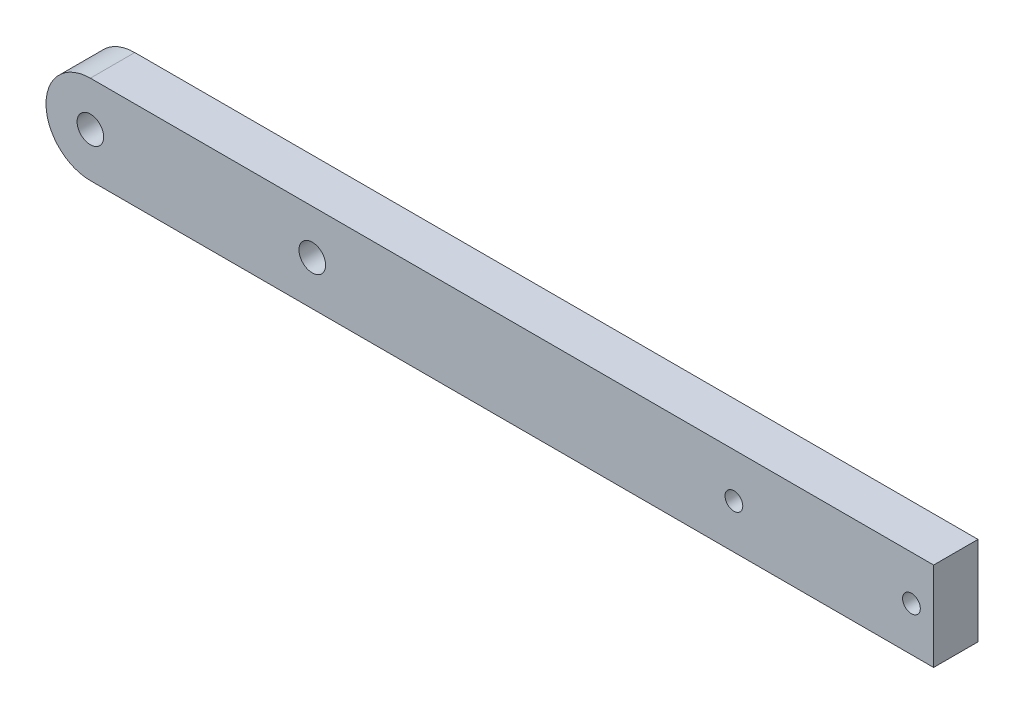
ISO-10303-21;
HEADER;
FILE_DESCRIPTION(('STEP AP214'),'2;1');
FILE_NAME('part.step','',(''),(''),'','','');
FILE_SCHEMA(('AUTOMOTIVE_DESIGN { 1 0 10303 214 1 1 1 1 }'));
ENDSEC;
DATA;
#1=APPLICATION_CONTEXT('core data for automotive mechanical design processes');
#2=APPLICATION_PROTOCOL_DEFINITION('international standard','automotive_design',2000,#1);
#3=PRODUCT_CONTEXT('',#1,'mechanical');
#4=PRODUCT('Part','Part','',(#3));
#5=PRODUCT_RELATED_PRODUCT_CATEGORY('part','',(#4));
#6=PRODUCT_DEFINITION_FORMATION('','',#4);
#7=PRODUCT_DEFINITION_CONTEXT('part definition',#1,'design');
#8=PRODUCT_DEFINITION('design','',#6,#7);
#9=PRODUCT_DEFINITION_SHAPE('','',#8);
#10=(LENGTH_UNIT() NAMED_UNIT(*) SI_UNIT(.MILLI.,.METRE.));
#11=(NAMED_UNIT(*) PLANE_ANGLE_UNIT() SI_UNIT($,.RADIAN.));
#12=(NAMED_UNIT(*) SI_UNIT($,.STERADIAN.) SOLID_ANGLE_UNIT());
#13=UNCERTAINTY_MEASURE_WITH_UNIT(LENGTH_MEASURE(1.E-05),#10,'distance_accuracy_value','');
#14=(GEOMETRIC_REPRESENTATION_CONTEXT(3) GLOBAL_UNCERTAINTY_ASSIGNED_CONTEXT((#13)) GLOBAL_UNIT_ASSIGNED_CONTEXT((#10,
#11,#12)) REPRESENTATION_CONTEXT('',''));
#15=CARTESIAN_POINT('',(0.,0.,0.));
#16=DIRECTION('',(0.,0.,1.));
#17=DIRECTION('',(1.,0.,0.));
#18=AXIS2_PLACEMENT_3D('',#15,#16,#17);
#19=CARTESIAN_POINT('',(0.,0.,-10.));
#20=DIRECTION('',(0.,0.,-1.));
#21=DIRECTION('',(1.,0.,0.));
#22=AXIS2_PLACEMENT_3D('',#19,#20,#21);
#23=PLANE('',#22);
#24=CARTESIAN_POINT('',(95.,0.,-10.));
#25=DIRECTION('',(0.,0.,1.));
#26=DIRECTION('',(1.,0.,0.));
#27=AXIS2_PLACEMENT_3D('',#24,#25,#26);
#28=CIRCLE('',#27,2.);
#29=CARTESIAN_POINT('',(97.,0.,-10.));
#30=VERTEX_POINT('',#29);
#31=EDGE_CURVE('E148',#30,#30,#28,.T.);
#32=ORIENTED_EDGE('',*,*,#31,.T.);
#33=EDGE_LOOP('',(#32));
#34=FACE_BOUND('',#33,.T.);
#35=CARTESIAN_POINT('',(-90.,0.,-10.));
#36=DIRECTION('',(0.,0.,1.));
#37=DIRECTION('',(1.,0.,0.));
#38=AXIS2_PLACEMENT_3D('',#35,#36,#37);
#39=CIRCLE('',#38,2.99999999999999);
#40=CARTESIAN_POINT('',(-87.,0.,-10.));
#41=VERTEX_POINT('',#40);
#42=EDGE_CURVE('E118',#41,#41,#39,.T.);
#43=ORIENTED_EDGE('',*,*,#42,.T.);
#44=EDGE_LOOP('',(#43));
#45=FACE_BOUND('',#44,.T.);
#46=CARTESIAN_POINT('',(-90.,0.,-10.));
#47=DIRECTION('',(0.,0.,1.));
#48=DIRECTION('',(1.,0.,0.));
#49=AXIS2_PLACEMENT_3D('',#46,#47,#48);
#50=CIRCLE('',#49,10.);
#51=CARTESIAN_POINT('',(-90.,10.,-10.));
#52=VERTEX_POINT('',#51);
#53=CARTESIAN_POINT('',(-100.,0.,-10.));
#54=VERTEX_POINT('',#53);
#55=EDGE_CURVE('E110',#52,#54,#50,.T.);
#56=ORIENTED_EDGE('',*,*,#55,.F.);
#57=DIRECTION('',(-1.,0.,0.));
#58=VECTOR('',#57,1.);
#59=CARTESIAN_POINT('',(-100.,10.,-10.));
#60=LINE('',#59,#58);
#61=CARTESIAN_POINT('',(100.,10.,-10.));
#62=VERTEX_POINT('',#61);
#63=EDGE_CURVE('E91',#62,#52,#60,.T.);
#64=ORIENTED_EDGE('',*,*,#63,.F.);
#65=DIRECTION('',(0.,1.,0.));
#66=VECTOR('',#65,1.);
#67=CARTESIAN_POINT('',(100.,10.,-10.));
#68=LINE('',#67,#66);
#69=CARTESIAN_POINT('',(100.,-10.,-10.));
#70=VERTEX_POINT('',#69);
#71=EDGE_CURVE('E102',#70,#62,#68,.T.);
#72=ORIENTED_EDGE('',*,*,#71,.F.);
#73=DIRECTION('',(1.,0.,0.));
#74=VECTOR('',#73,1.);
#75=CARTESIAN_POINT('',(-100.,-10.,-10.));
#76=LINE('',#75,#74);
#77=CARTESIAN_POINT('',(-90.,-10.,-10.));
#78=VERTEX_POINT('',#77);
#79=EDGE_CURVE('E111',#78,#70,#76,.T.);
#80=ORIENTED_EDGE('',*,*,#79,.F.);
#81=CARTESIAN_POINT('',(-90.,0.,-10.));
#82=DIRECTION('',(0.,0.,1.));
#83=DIRECTION('',(1.,0.,0.));
#84=AXIS2_PLACEMENT_3D('',#81,#82,#83);
#85=CIRCLE('',#84,10.);
#86=EDGE_CURVE('E50',#54,#78,#85,.T.);
#87=ORIENTED_EDGE('',*,*,#86,.F.);
#88=EDGE_LOOP('',(#56,#64,#72,#80,#87));
#89=FACE_BOUND('',#88,.T.);
#90=CARTESIAN_POINT('',(-40.,0.,-10.));
#91=DIRECTION('',(0.,0.,1.));
#92=DIRECTION('',(1.,0.,0.));
#93=AXIS2_PLACEMENT_3D('',#90,#91,#92);
#94=CIRCLE('',#93,3.00000000000001);
#95=CARTESIAN_POINT('',(-37.,0.,-10.));
#96=VERTEX_POINT('',#95);
#97=EDGE_CURVE('E154',#96,#96,#94,.T.);
#98=ORIENTED_EDGE('',*,*,#97,.T.);
#99=EDGE_LOOP('',(#98));
#100=FACE_BOUND('',#99,.T.);
#101=CARTESIAN_POINT('',(55.,0.,-10.));
#102=DIRECTION('',(0.,0.,1.));
#103=DIRECTION('',(1.,0.,0.));
#104=AXIS2_PLACEMENT_3D('',#101,#102,#103);
#105=CIRCLE('',#104,2.);
#106=CARTESIAN_POINT('',(57.,0.,-10.));
#107=VERTEX_POINT('',#106);
#108=EDGE_CURVE('E140',#107,#107,#105,.T.);
#109=ORIENTED_EDGE('',*,*,#108,.T.);
#110=EDGE_LOOP('',(#109));
#111=FACE_BOUND('',#110,.T.);
#112=ADVANCED_FACE('F41',(#34,#45,#89,#100,#111),#23,.T.);
#113=CARTESIAN_POINT('',(0.,0.,0.));
#114=DIRECTION('',(0.,0.,-1.));
#115=DIRECTION('',(1.,0.,0.));
#116=AXIS2_PLACEMENT_3D('',#113,#114,#115);
#117=PLANE('',#116);
#118=DIRECTION('',(1.,0.,0.));
#119=VECTOR('',#118,1.);
#120=CARTESIAN_POINT('',(-100.,-10.,0.));
#121=LINE('',#120,#119);
#122=CARTESIAN_POINT('',(-90.,-10.,0.));
#123=VERTEX_POINT('',#122);
#124=CARTESIAN_POINT('',(100.,-10.,0.));
#125=VERTEX_POINT('',#124);
#126=EDGE_CURVE('E107',#123,#125,#121,.T.);
#127=ORIENTED_EDGE('',*,*,#126,.T.);
#128=DIRECTION('',(0.,1.,0.));
#129=VECTOR('',#128,1.);
#130=CARTESIAN_POINT('',(100.,10.,0.));
#131=LINE('',#130,#129);
#132=CARTESIAN_POINT('',(100.,10.,0.));
#133=VERTEX_POINT('',#132);
#134=EDGE_CURVE('E116',#125,#133,#131,.T.);
#135=ORIENTED_EDGE('',*,*,#134,.T.);
#136=DIRECTION('',(-1.,0.,0.));
#137=VECTOR('',#136,1.);
#138=CARTESIAN_POINT('',(-100.,10.,0.));
#139=LINE('',#138,#137);
#140=CARTESIAN_POINT('',(-90.,10.,0.));
#141=VERTEX_POINT('',#140);
#142=EDGE_CURVE('E94',#133,#141,#139,.T.);
#143=ORIENTED_EDGE('',*,*,#142,.T.);
#144=CARTESIAN_POINT('',(-90.,0.,0.));
#145=DIRECTION('',(0.,0.,1.));
#146=DIRECTION('',(1.,0.,0.));
#147=AXIS2_PLACEMENT_3D('',#144,#145,#146);
#148=CIRCLE('',#147,10.);
#149=CARTESIAN_POINT('',(-100.,0.,0.));
#150=VERTEX_POINT('',#149);
#151=EDGE_CURVE('E124',#150,#141,#148,.F.);
#152=ORIENTED_EDGE('',*,*,#151,.F.);
#153=CARTESIAN_POINT('',(-90.,0.,0.));
#154=DIRECTION('',(0.,0.,1.));
#155=DIRECTION('',(1.,0.,0.));
#156=AXIS2_PLACEMENT_3D('',#153,#154,#155);
#157=CIRCLE('',#156,10.);
#158=EDGE_CURVE('E126',#123,#150,#157,.F.);
#159=ORIENTED_EDGE('',*,*,#158,.F.);
#160=EDGE_LOOP('',(#127,#135,#143,#152,#159));
#161=FACE_BOUND('',#160,.T.);
#162=CARTESIAN_POINT('',(-90.,0.,0.));
#163=DIRECTION('',(0.,0.,1.));
#164=DIRECTION('',(1.,0.,0.));
#165=AXIS2_PLACEMENT_3D('',#162,#163,#164);
#166=CIRCLE('',#165,2.99999999999999);
#167=CARTESIAN_POINT('',(-87.,0.,0.));
#168=VERTEX_POINT('',#167);
#169=EDGE_CURVE('E157',#168,#168,#166,.T.);
#170=ORIENTED_EDGE('',*,*,#169,.F.);
#171=EDGE_LOOP('',(#170));
#172=FACE_BOUND('',#171,.T.);
#173=CARTESIAN_POINT('',(-40.,0.,0.));
#174=DIRECTION('',(0.,0.,1.));
#175=DIRECTION('',(1.,0.,0.));
#176=AXIS2_PLACEMENT_3D('',#173,#174,#175);
#177=CIRCLE('',#176,3.00000000000001);
#178=CARTESIAN_POINT('',(-37.,0.,0.));
#179=VERTEX_POINT('',#178);
#180=EDGE_CURVE('E151',#179,#179,#177,.T.);
#181=ORIENTED_EDGE('',*,*,#180,.F.);
#182=EDGE_LOOP('',(#181));
#183=FACE_BOUND('',#182,.T.);
#184=CARTESIAN_POINT('',(95.,0.,0.));
#185=DIRECTION('',(0.,0.,1.));
#186=DIRECTION('',(1.,0.,0.));
#187=AXIS2_PLACEMENT_3D('',#184,#185,#186);
#188=CIRCLE('',#187,2.);
#189=CARTESIAN_POINT('',(97.,0.,0.));
#190=VERTEX_POINT('',#189);
#191=EDGE_CURVE('E145',#190,#190,#188,.T.);
#192=ORIENTED_EDGE('',*,*,#191,.F.);
#193=EDGE_LOOP('',(#192));
#194=FACE_BOUND('',#193,.T.);
#195=CARTESIAN_POINT('',(55.,0.,0.));
#196=DIRECTION('',(0.,0.,1.));
#197=DIRECTION('',(1.,0.,0.));
#198=AXIS2_PLACEMENT_3D('',#195,#196,#197);
#199=CIRCLE('',#198,2.);
#200=CARTESIAN_POINT('',(57.,0.,0.));
#201=VERTEX_POINT('',#200);
#202=EDGE_CURVE('E138',#201,#201,#199,.T.);
#203=ORIENTED_EDGE('',*,*,#202,.F.);
#204=EDGE_LOOP('',(#203));
#205=FACE_BOUND('',#204,.T.);
#206=ADVANCED_FACE('F135',(#161,#172,#183,#194,#205),#117,.F.);
#207=CARTESIAN_POINT('',(100.,10.,-10.));
#208=DIRECTION('',(-1.,0.,0.));
#209=DIRECTION('',(0.,0.,-1.));
#210=AXIS2_PLACEMENT_3D('',#207,#208,#209);
#211=PLANE('',#210);
#212=ORIENTED_EDGE('',*,*,#134,.F.);
#213=DIRECTION('',(0.,0.,1.));
#214=VECTOR('',#213,1.);
#215=CARTESIAN_POINT('',(100.,-10.,-10.));
#216=LINE('',#215,#214);
#217=EDGE_CURVE('E99',#70,#125,#216,.T.);
#218=ORIENTED_EDGE('',*,*,#217,.F.);
#219=ORIENTED_EDGE('',*,*,#71,.T.);
#220=DIRECTION('',(0.,0.,1.));
#221=VECTOR('',#220,1.);
#222=CARTESIAN_POINT('',(100.,10.,-10.));
#223=LINE('',#222,#221);
#224=EDGE_CURVE('E87',#62,#133,#223,.T.);
#225=ORIENTED_EDGE('',*,*,#224,.T.);
#226=EDGE_LOOP('',(#212,#218,#219,#225));
#227=FACE_BOUND('',#226,.T.);
#228=ADVANCED_FACE('F103',(#227),#211,.F.);
#229=CARTESIAN_POINT('',(-100.,10.,-10.));
#230=DIRECTION('',(0.,-1.,0.));
#231=DIRECTION('',(0.,0.,1.));
#232=AXIS2_PLACEMENT_3D('',#229,#230,#231);
#233=PLANE('',#232);
#234=ORIENTED_EDGE('',*,*,#142,.F.);
#235=ORIENTED_EDGE('',*,*,#224,.F.);
#236=ORIENTED_EDGE('',*,*,#63,.T.);
#237=DIRECTION('',(0.,0.,1.));
#238=VECTOR('',#237,1.);
#239=CARTESIAN_POINT('',(-90.,10.,-10.));
#240=LINE('',#239,#238);
#241=EDGE_CURVE('E11',#141,#52,#240,.F.);
#242=ORIENTED_EDGE('',*,*,#241,.F.);
#243=EDGE_LOOP('',(#234,#235,#236,#242));
#244=FACE_BOUND('',#243,.T.);
#245=ADVANCED_FACE('F89',(#244),#233,.F.);
#246=CARTESIAN_POINT('',(-100.,-10.,-10.));
#247=DIRECTION('',(0.,1.,0.));
#248=DIRECTION('',(0.,0.,-1.));
#249=AXIS2_PLACEMENT_3D('',#246,#247,#248);
#250=PLANE('',#249);
#251=ORIENTED_EDGE('',*,*,#79,.T.);
#252=ORIENTED_EDGE('',*,*,#217,.T.);
#253=ORIENTED_EDGE('',*,*,#126,.F.);
#254=DIRECTION('',(0.,0.,1.));
#255=VECTOR('',#254,1.);
#256=CARTESIAN_POINT('',(-90.,-10.,-10.));
#257=LINE('',#256,#255);
#258=EDGE_CURVE('E98',#78,#123,#257,.T.);
#259=ORIENTED_EDGE('',*,*,#258,.F.);
#260=EDGE_LOOP('',(#251,#252,#253,#259));
#261=FACE_BOUND('',#260,.T.);
#262=ADVANCED_FACE('F132',(#261),#250,.F.);
#263=CARTESIAN_POINT('',(-90.,0.,-10.));
#264=DIRECTION('',(0.,0.,1.));
#265=DIRECTION('',(-1.,0.,0.));
#266=AXIS2_PLACEMENT_3D('',#263,#264,#265);
#267=CYLINDRICAL_SURFACE('',#266,2.99999999999999);
#268=ORIENTED_EDGE('',*,*,#42,.F.);
#269=EDGE_LOOP('',(#268));
#270=FACE_BOUND('',#269,.T.);
#271=ORIENTED_EDGE('',*,*,#169,.T.);
#272=EDGE_LOOP('',(#271));
#273=FACE_BOUND('',#272,.T.);
#274=ADVANCED_FACE('F164',(#270,#273),#267,.F.);
#275=CARTESIAN_POINT('',(-40.,0.,-10.));
#276=DIRECTION('',(0.,0.,1.));
#277=DIRECTION('',(-1.,0.,0.));
#278=AXIS2_PLACEMENT_3D('',#275,#276,#277);
#279=CYLINDRICAL_SURFACE('',#278,3.00000000000001);
#280=ORIENTED_EDGE('',*,*,#97,.F.);
#281=EDGE_LOOP('',(#280));
#282=FACE_BOUND('',#281,.T.);
#283=ORIENTED_EDGE('',*,*,#180,.T.);
#284=EDGE_LOOP('',(#283));
#285=FACE_BOUND('',#284,.T.);
#286=ADVANCED_FACE('F176',(#282,#285),#279,.F.);
#287=CARTESIAN_POINT('',(95.,0.,-10.));
#288=DIRECTION('',(0.,0.,1.));
#289=DIRECTION('',(-1.,0.,0.));
#290=AXIS2_PLACEMENT_3D('',#287,#288,#289);
#291=CYLINDRICAL_SURFACE('',#290,2.);
#292=ORIENTED_EDGE('',*,*,#31,.F.);
#293=EDGE_LOOP('',(#292));
#294=FACE_BOUND('',#293,.T.);
#295=ORIENTED_EDGE('',*,*,#191,.T.);
#296=EDGE_LOOP('',(#295));
#297=FACE_BOUND('',#296,.T.);
#298=ADVANCED_FACE('F173',(#294,#297),#291,.F.);
#299=CARTESIAN_POINT('',(55.,0.,-10.));
#300=DIRECTION('',(0.,0.,1.));
#301=DIRECTION('',(-1.,0.,0.));
#302=AXIS2_PLACEMENT_3D('',#299,#300,#301);
#303=CYLINDRICAL_SURFACE('',#302,2.);
#304=ORIENTED_EDGE('',*,*,#108,.F.);
#305=EDGE_LOOP('',(#304));
#306=FACE_BOUND('',#305,.T.);
#307=ORIENTED_EDGE('',*,*,#202,.T.);
#308=EDGE_LOOP('',(#307));
#309=FACE_BOUND('',#308,.T.);
#310=ADVANCED_FACE('F175',(#306,#309),#303,.F.);
#311=CARTESIAN_POINT('',(-90.,0.,-10.));
#312=DIRECTION('',(0.,0.,1.));
#313=DIRECTION('',(-1.,0.,0.));
#314=AXIS2_PLACEMENT_3D('',#311,#312,#313);
#315=CYLINDRICAL_SURFACE('',#314,10.);
#316=DIRECTION('',(0.,0.,1.));
#317=VECTOR('',#316,1.);
#318=CARTESIAN_POINT('',(-100.,0.,-10.));
#319=LINE('',#318,#317);
#320=EDGE_CURVE('E45',#54,#150,#319,.T.);
#321=ORIENTED_EDGE('',*,*,#320,.T.);
#322=ORIENTED_EDGE('',*,*,#151,.T.);
#323=ORIENTED_EDGE('',*,*,#241,.T.);
#324=ORIENTED_EDGE('',*,*,#55,.T.);
#325=EDGE_LOOP('',(#321,#322,#323,#324));
#326=FACE_BOUND('',#325,.T.);
#327=ADVANCED_FACE('F43',(#326),#315,.T.);
#328=CARTESIAN_POINT('',(-90.,0.,-10.));
#329=DIRECTION('',(0.,0.,1.));
#330=DIRECTION('',(-1.,0.,0.));
#331=AXIS2_PLACEMENT_3D('',#328,#329,#330);
#332=CYLINDRICAL_SURFACE('',#331,10.);
#333=ORIENTED_EDGE('',*,*,#86,.T.);
#334=ORIENTED_EDGE('',*,*,#258,.T.);
#335=ORIENTED_EDGE('',*,*,#158,.T.);
#336=ORIENTED_EDGE('',*,*,#320,.F.);
#337=EDGE_LOOP('',(#333,#334,#335,#336));
#338=FACE_BOUND('',#337,.T.);
#339=ADVANCED_FACE('F129',(#338),#332,.T.);
#340=CLOSED_SHELL('',(#112,#206,#228,#245,#262,#274,#286,#298,#310,#327,#339));
#341=MANIFOLD_SOLID_BREP('B2',#340);
#342=ADVANCED_BREP_SHAPE_REPRESENTATION('',(#18,#341),#14);
#343=SHAPE_DEFINITION_REPRESENTATION(#9,#342);
ENDSEC;
END-ISO-10303-21;
